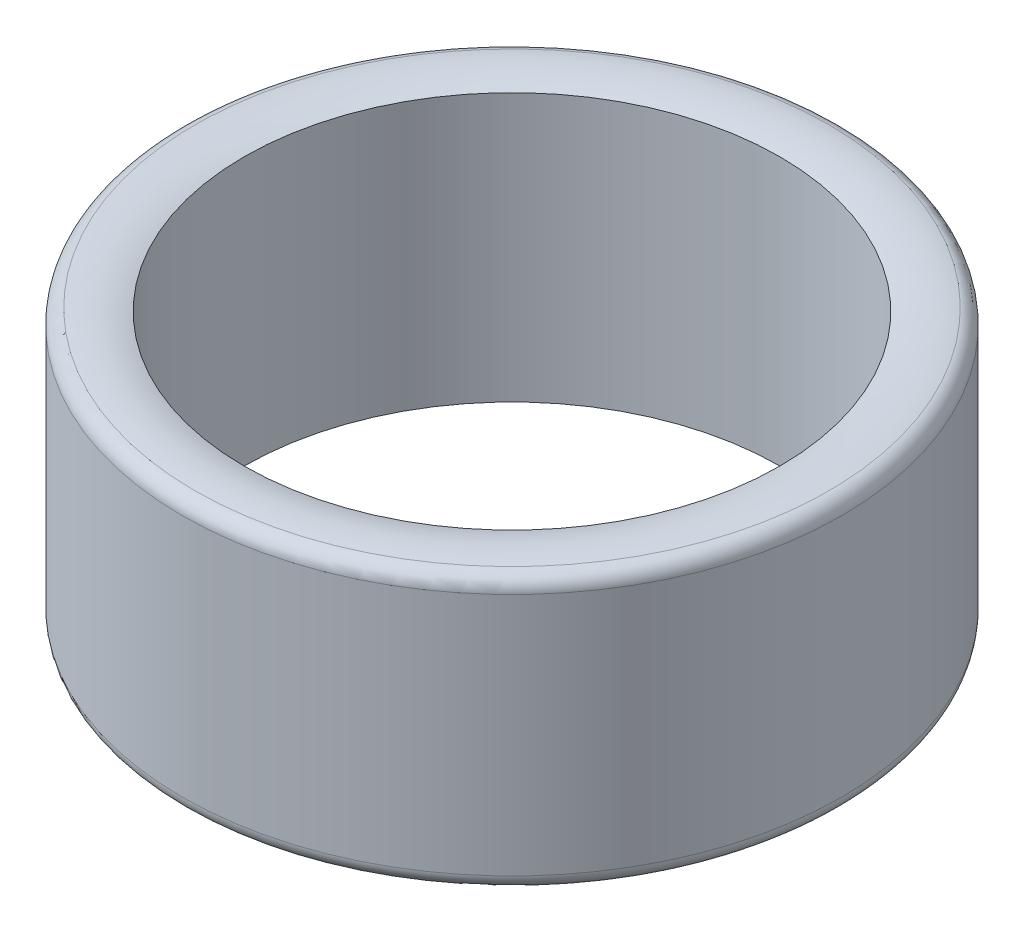
ISO-10303-21;
HEADER;
FILE_DESCRIPTION(('STEP AP214'),'2;1');
FILE_NAME('part.step','',(''),(''),'','','');
FILE_SCHEMA(('AUTOMOTIVE_DESIGN { 1 0 10303 214 1 1 1 1 }'));
ENDSEC;
DATA;
#1=APPLICATION_CONTEXT('core data for automotive mechanical design processes');
#2=APPLICATION_PROTOCOL_DEFINITION('international standard','automotive_design',2000,#1);
#3=PRODUCT_CONTEXT('',#1,'mechanical');
#4=PRODUCT('Part','Part','',(#3));
#5=PRODUCT_RELATED_PRODUCT_CATEGORY('part','',(#4));
#6=PRODUCT_DEFINITION_FORMATION('','',#4);
#7=PRODUCT_DEFINITION_CONTEXT('part definition',#1,'design');
#8=PRODUCT_DEFINITION('design','',#6,#7);
#9=PRODUCT_DEFINITION_SHAPE('','',#8);
#10=(LENGTH_UNIT() NAMED_UNIT(*) SI_UNIT(.MILLI.,.METRE.));
#11=(NAMED_UNIT(*) PLANE_ANGLE_UNIT() SI_UNIT($,.RADIAN.));
#12=(NAMED_UNIT(*) SI_UNIT($,.STERADIAN.) SOLID_ANGLE_UNIT());
#13=UNCERTAINTY_MEASURE_WITH_UNIT(LENGTH_MEASURE(1.E-05),#10,'distance_accuracy_value','');
#14=(GEOMETRIC_REPRESENTATION_CONTEXT(3) GLOBAL_UNCERTAINTY_ASSIGNED_CONTEXT((#13)) GLOBAL_UNIT_ASSIGNED_CONTEXT((#10,
#11,#12)) REPRESENTATION_CONTEXT('',''));
#15=CARTESIAN_POINT('',(0.,0.,0.));
#16=DIRECTION('',(0.,0.,1.));
#17=DIRECTION('',(1.,0.,0.));
#18=AXIS2_PLACEMENT_3D('',#15,#16,#17);
#19=CARTESIAN_POINT('',(0.,13.,0.));
#20=DIRECTION('',(0.,-1.,0.));
#21=DIRECTION('',(0.,0.,-1.));
#22=AXIS2_PLACEMENT_3D('',#19,#20,#21);
#23=CYLINDRICAL_SURFACE('',#22,32.);
#24=CARTESIAN_POINT('',(0.,-11.8272082511713,0.));
#25=DIRECTION('',(0.,1.,0.));
#26=DIRECTION('',(0.,0.,1.));
#27=AXIS2_PLACEMENT_3D('',#24,#25,#26);
#28=CIRCLE('',#27,32.);
#29=CARTESIAN_POINT('',(0.,-11.8272082511713,-32.));
#30=VERTEX_POINT('',#29);
#31=EDGE_CURVE('E39',#30,#30,#28,.T.);
#32=CARTESIAN_POINT('',(0.,11.8272082511713,0.));
#33=DIRECTION('',(0.,-1.,0.));
#34=DIRECTION('',(0.,0.,-1.));
#35=AXIS2_PLACEMENT_3D('',#32,#33,#34);
#36=CIRCLE('',#35,32.);
#37=CARTESIAN_POINT('',(0.,11.8272082511713,-32.));
#38=VERTEX_POINT('',#37);
#39=EDGE_CURVE('E43',#38,#38,#36,.T.);
#40=CARTESIAN_POINT('',(0.,-11.8272082511713,-32.));
#41=CARTESIAN_POINT('',(0.,-11.5808080792719,-32.));
#42=CARTESIAN_POINT('',(0.,-11.3344079073725,-32.));
#43=CARTESIAN_POINT('',(0.,-10.8416075635737,-32.));
#44=CARTESIAN_POINT('',(0.,-10.5952073916743,-32.));
#45=CARTESIAN_POINT('',(0.,-10.1024070478755,-32.));
#46=CARTESIAN_POINT('',(0.,-9.85600687597608,-32.));
#47=CARTESIAN_POINT('',(0.,-9.36320653217728,-32.));
#48=CARTESIAN_POINT('',(0.,-9.11680636027788,-32.));
#49=CARTESIAN_POINT('',(0.,-8.62400601647907,-32.));
#50=CARTESIAN_POINT('',(0.,-8.37760584457967,-32.));
#51=CARTESIAN_POINT('',(0.,-7.88480550078087,-32.));
#52=CARTESIAN_POINT('',(0.,-7.63840532888146,-32.));
#53=CARTESIAN_POINT('',(0.,-7.14560498508266,-32.));
#54=CARTESIAN_POINT('',(0.,-6.89920481318326,-32.));
#55=CARTESIAN_POINT('',(0.,-6.40640446938445,-32.));
#56=CARTESIAN_POINT('',(0.,-6.16000429748505,-32.));
#57=CARTESIAN_POINT('',(0.,-5.66720395368625,-32.));
#58=CARTESIAN_POINT('',(0.,-5.42080378178684,-32.));
#59=CARTESIAN_POINT('',(0.,-4.92800343798804,-32.));
#60=CARTESIAN_POINT('',(0.,-4.68160326608864,-32.));
#61=CARTESIAN_POINT('',(0.,-4.18880292228983,-32.));
#62=CARTESIAN_POINT('',(0.,-3.94240275039043,-32.));
#63=CARTESIAN_POINT('',(0.,-3.44960240659163,-32.));
#64=CARTESIAN_POINT('',(0.,-3.20320223469223,-32.));
#65=CARTESIAN_POINT('',(0.,-2.71040189089342,-32.));
#66=CARTESIAN_POINT('',(0.,-2.46400171899402,-32.));
#67=CARTESIAN_POINT('',(0.,-1.97120137519522,-32.));
#68=CARTESIAN_POINT('',(0.,-1.72480120329581,-32.));
#69=CARTESIAN_POINT('',(0.,-1.23200085949701,-32.));
#70=CARTESIAN_POINT('',(0.,-0.985600687597609,-32.));
#71=CARTESIAN_POINT('',(0.,-0.492800343798805,-32.));
#72=CARTESIAN_POINT('',(0.,-0.246400171899402,-32.));
#73=CARTESIAN_POINT('',(0.,0.246400171899402,-32.));
#74=CARTESIAN_POINT('',(0.,0.492800343798805,-32.));
#75=CARTESIAN_POINT('',(0.,0.985600687597609,-32.));
#76=CARTESIAN_POINT('',(0.,1.23200085949701,-32.));
#77=CARTESIAN_POINT('',(0.,1.72480120329581,-32.));
#78=CARTESIAN_POINT('',(0.,1.97120137519522,-32.));
#79=CARTESIAN_POINT('',(0.,2.46400171899402,-32.));
#80=CARTESIAN_POINT('',(0.,2.71040189089342,-32.));
#81=CARTESIAN_POINT('',(0.,3.20320223469223,-32.));
#82=CARTESIAN_POINT('',(0.,3.44960240659163,-32.));
#83=CARTESIAN_POINT('',(0.,3.94240275039043,-32.));
#84=CARTESIAN_POINT('',(0.,4.18880292228984,-32.));
#85=CARTESIAN_POINT('',(0.,4.68160326608864,-32.));
#86=CARTESIAN_POINT('',(0.,4.92800343798804,-32.));
#87=CARTESIAN_POINT('',(0.,5.42080378178685,-32.));
#88=CARTESIAN_POINT('',(0.,5.66720395368625,-32.));
#89=CARTESIAN_POINT('',(0.,6.16000429748505,-32.));
#90=CARTESIAN_POINT('',(0.,6.40640446938446,-32.));
#91=CARTESIAN_POINT('',(0.,6.89920481318326,-32.));
#92=CARTESIAN_POINT('',(0.,7.14560498508266,-32.));
#93=CARTESIAN_POINT('',(0.,7.63840532888146,-32.));
#94=CARTESIAN_POINT('',(0.,7.88480550078087,-32.));
#95=CARTESIAN_POINT('',(0.,8.37760584457967,-32.));
#96=CARTESIAN_POINT('',(0.,8.62400601647907,-32.));
#97=CARTESIAN_POINT('',(0.,9.11680636027788,-32.));
#98=CARTESIAN_POINT('',(0.,9.36320653217728,-32.));
#99=CARTESIAN_POINT('',(0.,9.85600687597608,-32.));
#100=CARTESIAN_POINT('',(0.,10.1024070478755,-32.));
#101=CARTESIAN_POINT('',(0.,10.5952073916743,-32.));
#102=CARTESIAN_POINT('',(0.,10.8416075635737,-32.));
#103=CARTESIAN_POINT('',(0.,11.3344079073725,-32.));
#104=CARTESIAN_POINT('',(0.,11.5808080792719,-32.));
#105=CARTESIAN_POINT('',(0.,11.8272082511713,-32.));
#106=B_SPLINE_CURVE_WITH_KNOTS('',3,(#40,#41,#42,#43,#44,#45,#46,#47,#48,#49,#50,#51,#52,#53,
#54,#55,#56,#57,#58,#59,#60,#61,#62,#63,#64,#65,#66,#67,#68,#69,#70,#71,#72,#73,#74,#75,#76,#77,
#78,#79,#80,#81,#82,#83,#84,#85,#86,#87,#88,#89,#90,#91,#92,#93,#94,#95,#96,#97,#98,#99,#100,
#101,#102,#103,#104,#105),.UNSPECIFIED.,.F.,.F.,(4,2,2,2,2,2,2,2,2,2,2,2,2,2,2,2,2,2,2,2,2,2,2,
2,2,2,2,2,2,2,2,2,4),(0.,0.739200515698205,1.47840103139641,2.21760154709462,2.95680206279282,
3.69600257849103,4.43520309418924,5.17440360988744,5.91360412558565,6.65280464128386,
7.39200515698206,8.13120567268027,8.87040618837848,9.60960670407668,10.3488072197749,
11.0880077354731,11.8272082511713,12.5664087668695,13.3056092825677,14.0448097982659,
14.7840103139641,15.5232108296623,16.2624113453605,17.0016118610587,17.7408123767569,
18.4800128924552,19.2192134081534,19.9584139238516,20.6976144395498,21.436814955248,
22.1760154709462,22.9152159866444,23.6544165023426),.UNSPECIFIED.);
#107=EDGE_CURVE('BSEAM32',#30,#38,#106,.T.);
#108=ORIENTED_EDGE('',*,*,#31,.T.);
#109=ORIENTED_EDGE('',*,*,#39,.T.);
#110=ORIENTED_EDGE('',*,*,#107,.T.);
#111=ORIENTED_EDGE('',*,*,#107,.F.);
#112=EDGE_LOOP('',(#108,#110,#109,#111));
#113=FACE_BOUND('',#112,.T.);
#114=ADVANCED_FACE('F32',(#113),#23,.T.);
#115=CARTESIAN_POINT('',(0.,13.,0.));
#116=DIRECTION('',(0.,-1.,0.));
#117=DIRECTION('',(0.,0.,-1.));
#118=AXIS2_PLACEMENT_3D('',#115,#116,#117);
#119=CYLINDRICAL_SURFACE('',#118,26.);
#120=CARTESIAN_POINT('',(0.,13.,0.));
#121=DIRECTION('',(0.,-1.,0.));
#122=DIRECTION('',(0.,0.,-1.));
#123=AXIS2_PLACEMENT_3D('',#120,#121,#122);
#124=CIRCLE('',#123,26.);
#125=CARTESIAN_POINT('',(0.,13.,-26.));
#126=VERTEX_POINT('',#125);
#127=EDGE_CURVE('E55',#126,#126,#124,.T.);
#128=CARTESIAN_POINT('',(0.,-13.,0.));
#129=DIRECTION('',(0.,1.,0.));
#130=DIRECTION('',(0.,0.,1.));
#131=AXIS2_PLACEMENT_3D('',#128,#129,#130);
#132=CIRCLE('',#131,26.);
#133=CARTESIAN_POINT('',(0.,-13.,-26.));
#134=VERTEX_POINT('',#133);
#135=EDGE_CURVE('E52',#134,#134,#132,.T.);
#136=CARTESIAN_POINT('',(0.,13.,-26.));
#137=CARTESIAN_POINT('',(0.,12.7291666666667,-26.));
#138=CARTESIAN_POINT('',(0.,12.4583333333333,-26.));
#139=CARTESIAN_POINT('',(0.,11.9166666666667,-26.));
#140=CARTESIAN_POINT('',(0.,11.6458333333333,-26.));
#141=CARTESIAN_POINT('',(0.,11.1041666666667,-26.));
#142=CARTESIAN_POINT('',(0.,10.8333333333333,-26.));
#143=CARTESIAN_POINT('',(0.,10.2916666666667,-26.));
#144=CARTESIAN_POINT('',(0.,10.0208333333333,-26.));
#145=CARTESIAN_POINT('',(0.,9.47916666666667,-26.));
#146=CARTESIAN_POINT('',(0.,9.20833333333333,-26.));
#147=CARTESIAN_POINT('',(0.,8.66666666666667,-26.));
#148=CARTESIAN_POINT('',(0.,8.39583333333333,-26.));
#149=CARTESIAN_POINT('',(0.,7.85416666666667,-26.));
#150=CARTESIAN_POINT('',(0.,7.58333333333333,-26.));
#151=CARTESIAN_POINT('',(0.,7.04166666666667,-26.));
#152=CARTESIAN_POINT('',(0.,6.77083333333333,-26.));
#153=CARTESIAN_POINT('',(0.,6.22916666666667,-26.));
#154=CARTESIAN_POINT('',(0.,5.95833333333333,-26.));
#155=CARTESIAN_POINT('',(0.,5.41666666666667,-26.));
#156=CARTESIAN_POINT('',(0.,5.14583333333333,-26.));
#157=CARTESIAN_POINT('',(0.,4.60416666666667,-26.));
#158=CARTESIAN_POINT('',(0.,4.33333333333333,-26.));
#159=CARTESIAN_POINT('',(0.,3.79166666666667,-26.));
#160=CARTESIAN_POINT('',(0.,3.52083333333333,-26.));
#161=CARTESIAN_POINT('',(0.,2.97916666666667,-26.));
#162=CARTESIAN_POINT('',(0.,2.70833333333333,-26.));
#163=CARTESIAN_POINT('',(0.,2.16666666666667,-26.));
#164=CARTESIAN_POINT('',(0.,1.89583333333333,-26.));
#165=CARTESIAN_POINT('',(0.,1.35416666666667,-26.));
#166=CARTESIAN_POINT('',(0.,1.08333333333333,-26.));
#167=CARTESIAN_POINT('',(0.,0.541666666666667,-26.));
#168=CARTESIAN_POINT('',(0.,0.270833333333333,-26.));
#169=CARTESIAN_POINT('',(0.,-0.270833333333333,-26.));
#170=CARTESIAN_POINT('',(0.,-0.541666666666667,-26.));
#171=CARTESIAN_POINT('',(0.,-1.08333333333333,-26.));
#172=CARTESIAN_POINT('',(0.,-1.35416666666667,-26.));
#173=CARTESIAN_POINT('',(0.,-1.89583333333333,-26.));
#174=CARTESIAN_POINT('',(0.,-2.16666666666667,-26.));
#175=CARTESIAN_POINT('',(0.,-2.70833333333333,-26.));
#176=CARTESIAN_POINT('',(0.,-2.97916666666667,-26.));
#177=CARTESIAN_POINT('',(0.,-3.52083333333333,-26.));
#178=CARTESIAN_POINT('',(0.,-3.79166666666667,-26.));
#179=CARTESIAN_POINT('',(0.,-4.33333333333333,-26.));
#180=CARTESIAN_POINT('',(0.,-4.60416666666667,-26.));
#181=CARTESIAN_POINT('',(0.,-5.14583333333333,-26.));
#182=CARTESIAN_POINT('',(0.,-5.41666666666667,-26.));
#183=CARTESIAN_POINT('',(0.,-5.95833333333333,-26.));
#184=CARTESIAN_POINT('',(0.,-6.22916666666667,-26.));
#185=CARTESIAN_POINT('',(0.,-6.77083333333333,-26.));
#186=CARTESIAN_POINT('',(0.,-7.04166666666667,-26.));
#187=CARTESIAN_POINT('',(0.,-7.58333333333333,-26.));
#188=CARTESIAN_POINT('',(0.,-7.85416666666667,-26.));
#189=CARTESIAN_POINT('',(0.,-8.39583333333333,-26.));
#190=CARTESIAN_POINT('',(0.,-8.66666666666667,-26.));
#191=CARTESIAN_POINT('',(0.,-9.20833333333333,-26.));
#192=CARTESIAN_POINT('',(0.,-9.47916666666667,-26.));
#193=CARTESIAN_POINT('',(0.,-10.0208333333333,-26.));
#194=CARTESIAN_POINT('',(0.,-10.2916666666667,-26.));
#195=CARTESIAN_POINT('',(0.,-10.8333333333333,-26.));
#196=CARTESIAN_POINT('',(0.,-11.1041666666667,-26.));
#197=CARTESIAN_POINT('',(0.,-11.6458333333333,-26.));
#198=CARTESIAN_POINT('',(0.,-11.9166666666667,-26.));
#199=CARTESIAN_POINT('',(0.,-12.4583333333333,-26.));
#200=CARTESIAN_POINT('',(0.,-12.7291666666667,-26.));
#201=CARTESIAN_POINT('',(0.,-13.,-26.));
#202=B_SPLINE_CURVE_WITH_KNOTS('',3,(#136,#137,#138,#139,#140,#141,#142,#143,#144,#145,#146,
#147,#148,#149,#150,#151,#152,#153,#154,#155,#156,#157,#158,#159,#160,#161,#162,#163,#164,#165,
#166,#167,#168,#169,#170,#171,#172,#173,#174,#175,#176,#177,#178,#179,#180,#181,#182,#183,#184,
#185,#186,#187,#188,#189,#190,#191,#192,#193,#194,#195,#196,#197,#198,#199,#200,#201),
.UNSPECIFIED.,.F.,.F.,(4,2,2,2,2,2,2,2,2,2,2,2,2,2,2,2,2,2,2,2,2,2,2,2,2,2,2,2,2,2,2,2,4),(0.,
0.812499999999999,1.625,2.4375,3.25,4.0625,4.875,5.6875,6.5,7.3125,8.125,8.9375,9.75,10.5625,
11.375,12.1875,13.,13.8125,14.625,15.4375,16.25,17.0625,17.875,18.6875,19.5,20.3125,21.125,
21.9375,22.75,23.5625,24.375,25.1875,26.),.UNSPECIFIED.);
#203=EDGE_CURVE('BSEAM61',#126,#134,#202,.T.);
#204=ORIENTED_EDGE('',*,*,#127,.F.);
#205=ORIENTED_EDGE('',*,*,#135,.F.);
#206=ORIENTED_EDGE('',*,*,#203,.T.);
#207=ORIENTED_EDGE('',*,*,#203,.F.);
#208=EDGE_LOOP('',(#204,#206,#205,#207));
#209=FACE_BOUND('',#208,.T.);
#210=ADVANCED_FACE('F61',(#209),#119,.F.);
#211=CARTESIAN_POINT('',(0.,3.46060798583054,0.));
#212=DIRECTION('',(0.,-1.,0.));
#213=DIRECTION('',(0.,0.,-1.));
#214=AXIS2_PLACEMENT_3D('',#211,#212,#213);
#215=TOROIDAL_SURFACE('',#214,29.,10.);
#216=CARTESIAN_POINT('',(0.,13.3036671215252,0.));
#217=DIRECTION('',(0.,-1.,0.));
#218=DIRECTION('',(0.,0.,-1.));
#219=AXIS2_PLACEMENT_3D('',#216,#217,#218);
#220=CIRCLE('',#219,30.7647058823529);
#221=CARTESIAN_POINT('',(0.,13.3036671215252,-30.7647058823529));
#222=VERTEX_POINT('',#221);
#223=EDGE_CURVE('E10',#222,#222,#220,.F.);
#224=ORIENTED_EDGE('',*,*,#223,.T.);
#225=EDGE_LOOP('',(#224));
#226=FACE_BOUND('',#225,.T.);
#227=ORIENTED_EDGE('',*,*,#127,.T.);
#228=EDGE_LOOP('',(#227));
#229=FACE_BOUND('',#228,.T.);
#230=ADVANCED_FACE('F59',(#226,#229),#215,.T.);
#231=CARTESIAN_POINT('',(0.,-3.46060798583054,0.));
#232=DIRECTION('',(0.,1.,0.));
#233=DIRECTION('',(0.,0.,-1.));
#234=AXIS2_PLACEMENT_3D('',#231,#232,#233);
#235=TOROIDAL_SURFACE('',#234,29.,10.);
#236=CARTESIAN_POINT('',(0.,-13.3036671215252,0.));
#237=DIRECTION('',(0.,1.,0.));
#238=DIRECTION('',(0.,0.,1.));
#239=AXIS2_PLACEMENT_3D('',#236,#237,#238);
#240=CIRCLE('',#239,30.7647058823529);
#241=CARTESIAN_POINT('',(0.,-13.3036671215252,30.7647058823529));
#242=VERTEX_POINT('',#241);
#243=EDGE_CURVE('E47',#242,#242,#240,.F.);
#244=ORIENTED_EDGE('',*,*,#243,.T.);
#245=EDGE_LOOP('',(#244));
#246=FACE_BOUND('',#245,.T.);
#247=ORIENTED_EDGE('',*,*,#135,.T.);
#248=EDGE_LOOP('',(#247));
#249=FACE_BOUND('',#248,.T.);
#250=ADVANCED_FACE('F67',(#246,#249),#235,.T.);
#251=CARTESIAN_POINT('',(0.,-11.8272082511713,0.));
#252=DIRECTION('',(0.,1.,0.));
#253=DIRECTION('',(0.,0.,1.));
#254=AXIS2_PLACEMENT_3D('',#251,#252,#253);
#255=TOROIDAL_SURFACE('',#254,30.5,1.5);
#256=ORIENTED_EDGE('',*,*,#31,.F.);
#257=EDGE_LOOP('',(#256));
#258=FACE_BOUND('',#257,.T.);
#259=ORIENTED_EDGE('',*,*,#243,.F.);
#260=EDGE_LOOP('',(#259));
#261=FACE_BOUND('',#260,.T.);
#262=ADVANCED_FACE('F69',(#258,#261),#255,.T.);
#263=CARTESIAN_POINT('',(0.,11.8272082511713,0.));
#264=DIRECTION('',(0.,-1.,0.));
#265=DIRECTION('',(0.,0.,-1.));
#266=AXIS2_PLACEMENT_3D('',#263,#264,#265);
#267=TOROIDAL_SURFACE('',#266,30.5,1.5);
#268=ORIENTED_EDGE('',*,*,#39,.F.);
#269=EDGE_LOOP('',(#268));
#270=FACE_BOUND('',#269,.T.);
#271=ORIENTED_EDGE('',*,*,#223,.F.);
#272=EDGE_LOOP('',(#271));
#273=FACE_BOUND('',#272,.T.);
#274=ADVANCED_FACE('F34',(#270,#273),#267,.T.);
#275=CLOSED_SHELL('',(#114,#210,#230,#250,#262,#274));
#276=MANIFOLD_SOLID_BREP('B2',#275);
#277=ADVANCED_BREP_SHAPE_REPRESENTATION('',(#18,#276),#14);
#278=SHAPE_DEFINITION_REPRESENTATION(#9,#277);
ENDSEC;
END-ISO-10303-21;
